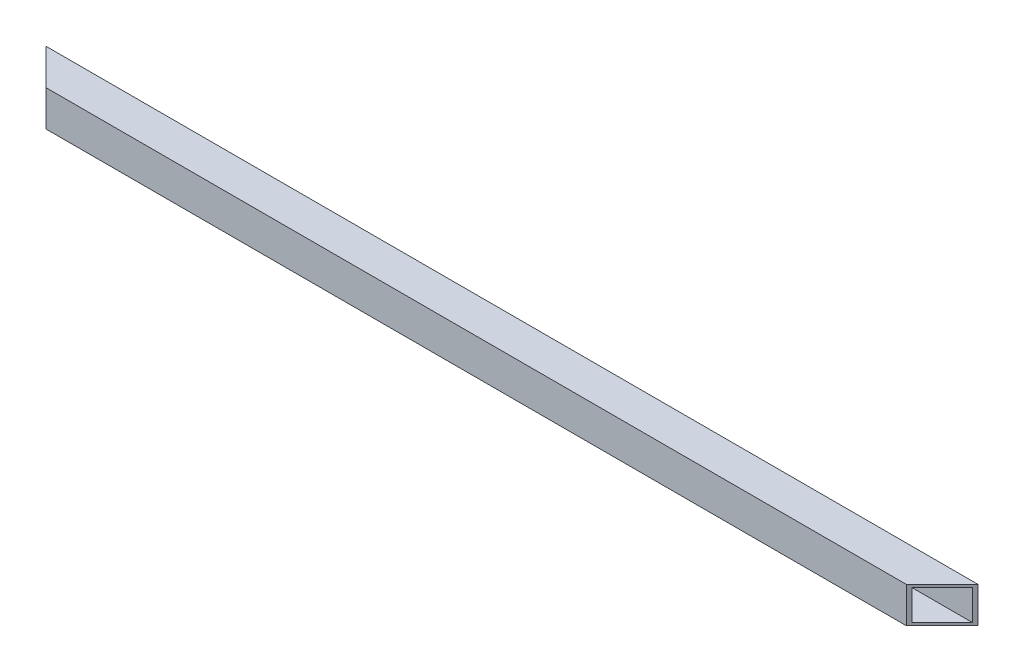
ISO-10303-21;
HEADER;
FILE_DESCRIPTION(('STEP AP214'),'2;1');
FILE_NAME('part.step','',(''),(''),'','','');
FILE_SCHEMA(('AUTOMOTIVE_DESIGN { 1 0 10303 214 1 1 1 1 }'));
ENDSEC;
DATA;
#1=APPLICATION_CONTEXT('core data for automotive mechanical design processes');
#2=APPLICATION_PROTOCOL_DEFINITION('international standard','automotive_design',2000,#1);
#3=PRODUCT_CONTEXT('',#1,'mechanical');
#4=PRODUCT('Part','Part','',(#3));
#5=PRODUCT_RELATED_PRODUCT_CATEGORY('part','',(#4));
#6=PRODUCT_DEFINITION_FORMATION('','',#4);
#7=PRODUCT_DEFINITION_CONTEXT('part definition',#1,'design');
#8=PRODUCT_DEFINITION('design','',#6,#7);
#9=PRODUCT_DEFINITION_SHAPE('','',#8);
#10=(LENGTH_UNIT() NAMED_UNIT(*) SI_UNIT(.MILLI.,.METRE.));
#11=(NAMED_UNIT(*) PLANE_ANGLE_UNIT() SI_UNIT($,.RADIAN.));
#12=(NAMED_UNIT(*) SI_UNIT($,.STERADIAN.) SOLID_ANGLE_UNIT());
#13=UNCERTAINTY_MEASURE_WITH_UNIT(LENGTH_MEASURE(1.E-05),#10,'distance_accuracy_value','');
#14=(GEOMETRIC_REPRESENTATION_CONTEXT(3) GLOBAL_UNCERTAINTY_ASSIGNED_CONTEXT((#13)) GLOBAL_UNIT_ASSIGNED_CONTEXT((#10,
#11,#12)) REPRESENTATION_CONTEXT('',''));
#15=CARTESIAN_POINT('',(0.,0.,0.));
#16=DIRECTION('',(0.,0.,1.));
#17=DIRECTION('',(1.,0.,0.));
#18=AXIS2_PLACEMENT_3D('',#15,#16,#17);
#19=CARTESIAN_POINT('',(250.,210.,-2310.));
#20=DIRECTION('',(0.,1.,0.));
#21=DIRECTION('',(0.,0.,1.));
#22=AXIS2_PLACEMENT_3D('',#19,#20,#21);
#23=PLANE('',#22);
#24=DIRECTION('',(0.707106781186548,0.,-0.707106781186548));
#25=VECTOR('',#24,1.);
#26=CARTESIAN_POINT('',(255.,210.,-2305.));
#27=LINE('',#26,#25);
#28=CARTESIAN_POINT('',(240.,210.,-2290.));
#29=VERTEX_POINT('',#28);
#30=CARTESIAN_POINT('',(260.,210.,-2310.));
#31=VERTEX_POINT('',#30);
#32=EDGE_CURVE('E166',#29,#31,#27,.T.);
#33=ORIENTED_EDGE('',*,*,#32,.F.);
#34=DIRECTION('',(-1.,0.,0.));
#35=VECTOR('',#34,1.);
#36=CARTESIAN_POINT('',(250.,210.,-2290.));
#37=LINE('',#36,#35);
#38=CARTESIAN_POINT('',(-240.,210.,-2290.));
#39=VERTEX_POINT('',#38);
#40=EDGE_CURVE('E53',#29,#39,#37,.T.);
#41=ORIENTED_EDGE('',*,*,#40,.T.);
#42=DIRECTION('',(0.707106781186548,0.,0.707106781186547));
#43=VECTOR('',#42,1.);
#44=CARTESIAN_POINT('',(-4.99999999999984,210.,-2055.));
#45=LINE('',#44,#43);
#46=CARTESIAN_POINT('',(-260.,210.,-2310.));
#47=VERTEX_POINT('',#46);
#48=EDGE_CURVE('E128',#47,#39,#45,.T.);
#49=ORIENTED_EDGE('',*,*,#48,.F.);
#50=DIRECTION('',(-1.,0.,0.));
#51=VECTOR('',#50,1.);
#52=CARTESIAN_POINT('',(250.,210.,-2310.));
#53=LINE('',#52,#51);
#54=EDGE_CURVE('E132',#31,#47,#53,.T.);
#55=ORIENTED_EDGE('',*,*,#54,.F.);
#56=EDGE_LOOP('',(#33,#41,#49,#55));
#57=FACE_BOUND('',#56,.T.);
#58=ADVANCED_FACE('F39',(#57),#23,.F.);
#59=CARTESIAN_POINT('',(250.,210.,-2310.));
#60=DIRECTION('',(0.,0.,1.));
#61=DIRECTION('',(1.,0.,0.));
#62=AXIS2_PLACEMENT_3D('',#59,#60,#61);
#63=PLANE('',#62);
#64=DIRECTION('',(0.,1.,0.));
#65=VECTOR('',#64,1.);
#66=CARTESIAN_POINT('',(260.,210.,-2310.));
#67=LINE('',#66,#65);
#68=CARTESIAN_POINT('',(260.,230.,-2310.));
#69=VERTEX_POINT('',#68);
#70=EDGE_CURVE('E163',#31,#69,#67,.T.);
#71=ORIENTED_EDGE('',*,*,#70,.F.);
#72=ORIENTED_EDGE('',*,*,#54,.T.);
#73=DIRECTION('',(0.,-1.,0.));
#74=VECTOR('',#73,1.);
#75=CARTESIAN_POINT('',(-260.,210.,-2310.));
#76=LINE('',#75,#74);
#77=CARTESIAN_POINT('',(-260.,230.,-2310.));
#78=VERTEX_POINT('',#77);
#79=EDGE_CURVE('E142',#78,#47,#76,.T.);
#80=ORIENTED_EDGE('',*,*,#79,.F.);
#81=DIRECTION('',(-1.,0.,0.));
#82=VECTOR('',#81,1.);
#83=CARTESIAN_POINT('',(250.,230.,-2310.));
#84=LINE('',#83,#82);
#85=EDGE_CURVE('E130',#69,#78,#84,.T.);
#86=ORIENTED_EDGE('',*,*,#85,.F.);
#87=EDGE_LOOP('',(#71,#72,#80,#86));
#88=FACE_BOUND('',#87,.T.);
#89=ADVANCED_FACE('F185',(#88),#63,.F.);
#90=CARTESIAN_POINT('',(250.,230.,-2310.));
#91=DIRECTION('',(0.,-1.,0.));
#92=DIRECTION('',(0.,0.,-1.));
#93=AXIS2_PLACEMENT_3D('',#90,#91,#92);
#94=PLANE('',#93);
#95=DIRECTION('',(-0.707106781186548,0.,0.707106781186548));
#96=VECTOR('',#95,1.);
#97=CARTESIAN_POINT('',(255.,230.,-2305.));
#98=LINE('',#97,#96);
#99=CARTESIAN_POINT('',(240.,230.,-2290.));
#100=VERTEX_POINT('',#99);
#101=EDGE_CURVE('E160',#69,#100,#98,.T.);
#102=ORIENTED_EDGE('',*,*,#101,.F.);
#103=ORIENTED_EDGE('',*,*,#85,.T.);
#104=DIRECTION('',(-0.707106781186548,0.,-0.707106781186547));
#105=VECTOR('',#104,1.);
#106=CARTESIAN_POINT('',(-4.99999999999984,230.,-2055.));
#107=LINE('',#106,#105);
#108=CARTESIAN_POINT('',(-240.,230.,-2290.));
#109=VERTEX_POINT('',#108);
#110=EDGE_CURVE('E145',#109,#78,#107,.T.);
#111=ORIENTED_EDGE('',*,*,#110,.F.);
#112=DIRECTION('',(-1.,0.,0.));
#113=VECTOR('',#112,1.);
#114=CARTESIAN_POINT('',(250.,230.,-2290.));
#115=LINE('',#114,#113);
#116=EDGE_CURVE('E127',#100,#109,#115,.T.);
#117=ORIENTED_EDGE('',*,*,#116,.F.);
#118=EDGE_LOOP('',(#102,#103,#111,#117));
#119=FACE_BOUND('',#118,.T.);
#120=ADVANCED_FACE('F189',(#119),#94,.F.);
#121=CARTESIAN_POINT('',(250.,210.,-2290.));
#122=DIRECTION('',(0.,0.,-1.));
#123=DIRECTION('',(-1.,0.,0.));
#124=AXIS2_PLACEMENT_3D('',#121,#122,#123);
#125=PLANE('',#124);
#126=DIRECTION('',(0.,-1.,0.));
#127=VECTOR('',#126,1.);
#128=CARTESIAN_POINT('',(240.,210.,-2290.));
#129=LINE('',#128,#127);
#130=EDGE_CURVE('E157',#100,#29,#129,.T.);
#131=ORIENTED_EDGE('',*,*,#130,.F.);
#132=ORIENTED_EDGE('',*,*,#116,.T.);
#133=DIRECTION('',(0.,1.,0.));
#134=VECTOR('',#133,1.);
#135=CARTESIAN_POINT('',(-240.,210.,-2290.));
#136=LINE('',#135,#134);
#137=EDGE_CURVE('E148',#39,#109,#136,.T.);
#138=ORIENTED_EDGE('',*,*,#137,.F.);
#139=ORIENTED_EDGE('',*,*,#40,.F.);
#140=EDGE_LOOP('',(#131,#132,#138,#139));
#141=FACE_BOUND('',#140,.T.);
#142=ADVANCED_FACE('F181',(#141),#125,.F.);
#143=CARTESIAN_POINT('',(-250.,220.,-2300.));
#144=DIRECTION('',(-0.707106781186547,0.,0.707106781186548));
#145=DIRECTION('',(0.707106781186548,0.,0.707106781186547));
#146=AXIS2_PLACEMENT_3D('',#143,#144,#145);
#147=PLANE('',#146);
#148=DIRECTION('',(0.,1.,0.));
#149=VECTOR('',#148,1.);
#150=CARTESIAN_POINT('',(-241.6,211.6,-2291.6));
#151=LINE('',#150,#149);
#152=CARTESIAN_POINT('',(-241.6,211.6,-2291.6));
#153=VERTEX_POINT('',#152);
#154=CARTESIAN_POINT('',(-241.6,228.4,-2291.6));
#155=VERTEX_POINT('',#154);
#156=EDGE_CURVE('E119',#153,#155,#151,.T.);
#157=ORIENTED_EDGE('',*,*,#156,.F.);
#158=DIRECTION('',(0.707106781186548,0.,0.707106781186547));
#159=VECTOR('',#158,1.);
#160=CARTESIAN_POINT('',(-4.19999999999998,211.6,-2054.2));
#161=LINE('',#160,#159);
#162=CARTESIAN_POINT('',(-258.4,211.6,-2308.4));
#163=VERTEX_POINT('',#162);
#164=EDGE_CURVE('E46',#163,#153,#161,.T.);
#165=ORIENTED_EDGE('',*,*,#164,.F.);
#166=DIRECTION('',(0.,-1.,0.));
#167=VECTOR('',#166,1.);
#168=CARTESIAN_POINT('',(-258.4,211.6,-2308.4));
#169=LINE('',#168,#167);
#170=CARTESIAN_POINT('',(-258.4,228.4,-2308.4));
#171=VERTEX_POINT('',#170);
#172=EDGE_CURVE('E154',#171,#163,#169,.T.);
#173=ORIENTED_EDGE('',*,*,#172,.F.);
#174=DIRECTION('',(-0.707106781186548,0.,-0.707106781186547));
#175=VECTOR('',#174,1.);
#176=CARTESIAN_POINT('',(-4.19999999999998,228.4,-2054.2));
#177=LINE('',#176,#175);
#178=EDGE_CURVE('E152',#155,#171,#177,.T.);
#179=ORIENTED_EDGE('',*,*,#178,.F.);
#180=EDGE_LOOP('',(#157,#165,#173,#179));
#181=FACE_BOUND('',#180,.T.);
#182=ORIENTED_EDGE('',*,*,#79,.T.);
#183=ORIENTED_EDGE('',*,*,#48,.T.);
#184=ORIENTED_EDGE('',*,*,#137,.T.);
#185=ORIENTED_EDGE('',*,*,#110,.T.);
#186=EDGE_LOOP('',(#182,#183,#184,#185));
#187=FACE_BOUND('',#186,.T.);
#188=ADVANCED_FACE('F178',(#181,#187),#147,.T.);
#189=CARTESIAN_POINT('',(250.,211.6,-2291.6));
#190=DIRECTION('',(0.,0.,-1.));
#191=DIRECTION('',(-1.,0.,0.));
#192=AXIS2_PLACEMENT_3D('',#189,#190,#191);
#193=PLANE('',#192);
#194=DIRECTION('',(-1.,0.,0.));
#195=VECTOR('',#194,1.);
#196=CARTESIAN_POINT('',(250.,228.4,-2291.6));
#197=LINE('',#196,#195);
#198=CARTESIAN_POINT('',(241.6,228.4,-2291.6));
#199=VERTEX_POINT('',#198);
#200=EDGE_CURVE('E110',#199,#155,#197,.T.);
#201=ORIENTED_EDGE('',*,*,#200,.F.);
#202=DIRECTION('',(0.,-1.,0.));
#203=VECTOR('',#202,1.);
#204=CARTESIAN_POINT('',(241.6,211.6,-2291.6));
#205=LINE('',#204,#203);
#206=CARTESIAN_POINT('',(241.6,211.6,-2291.6));
#207=VERTEX_POINT('',#206);
#208=EDGE_CURVE('E11',#199,#207,#205,.T.);
#209=ORIENTED_EDGE('',*,*,#208,.T.);
#210=DIRECTION('',(-1.,0.,0.));
#211=VECTOR('',#210,1.);
#212=CARTESIAN_POINT('',(250.,211.6,-2291.6));
#213=LINE('',#212,#211);
#214=EDGE_CURVE('E133',#207,#153,#213,.T.);
#215=ORIENTED_EDGE('',*,*,#214,.T.);
#216=ORIENTED_EDGE('',*,*,#156,.T.);
#217=EDGE_LOOP('',(#201,#209,#215,#216));
#218=FACE_BOUND('',#217,.T.);
#219=ADVANCED_FACE('F117',(#218),#193,.T.);
#220=CARTESIAN_POINT('',(250.,228.4,-2308.4));
#221=DIRECTION('',(0.,-1.,0.));
#222=DIRECTION('',(0.,0.,-1.));
#223=AXIS2_PLACEMENT_3D('',#220,#221,#222);
#224=PLANE('',#223);
#225=DIRECTION('',(-1.,0.,0.));
#226=VECTOR('',#225,1.);
#227=CARTESIAN_POINT('',(250.,228.4,-2308.4));
#228=LINE('',#227,#226);
#229=CARTESIAN_POINT('',(258.4,228.4,-2308.4));
#230=VERTEX_POINT('',#229);
#231=EDGE_CURVE('E112',#230,#171,#228,.T.);
#232=ORIENTED_EDGE('',*,*,#231,.F.);
#233=DIRECTION('',(-0.707106781186548,0.,0.707106781186548));
#234=VECTOR('',#233,1.);
#235=CARTESIAN_POINT('',(254.2,228.4,-2304.2));
#236=LINE('',#235,#234);
#237=EDGE_CURVE('E103',#230,#199,#236,.T.);
#238=ORIENTED_EDGE('',*,*,#237,.T.);
#239=ORIENTED_EDGE('',*,*,#200,.T.);
#240=ORIENTED_EDGE('',*,*,#178,.T.);
#241=EDGE_LOOP('',(#232,#238,#239,#240));
#242=FACE_BOUND('',#241,.T.);
#243=ADVANCED_FACE('F108',(#242),#224,.T.);
#244=CARTESIAN_POINT('',(250.,211.6,-2308.4));
#245=DIRECTION('',(0.,0.,1.));
#246=DIRECTION('',(1.,0.,0.));
#247=AXIS2_PLACEMENT_3D('',#244,#245,#246);
#248=PLANE('',#247);
#249=DIRECTION('',(-1.,0.,0.));
#250=VECTOR('',#249,1.);
#251=CARTESIAN_POINT('',(250.,211.6,-2308.4));
#252=LINE('',#251,#250);
#253=CARTESIAN_POINT('',(258.4,211.6,-2308.4));
#254=VERTEX_POINT('',#253);
#255=EDGE_CURVE('E122',#254,#163,#252,.T.);
#256=ORIENTED_EDGE('',*,*,#255,.F.);
#257=DIRECTION('',(0.,1.,0.));
#258=VECTOR('',#257,1.);
#259=CARTESIAN_POINT('',(258.4,211.6,-2308.4));
#260=LINE('',#259,#258);
#261=EDGE_CURVE('E114',#254,#230,#260,.T.);
#262=ORIENTED_EDGE('',*,*,#261,.T.);
#263=ORIENTED_EDGE('',*,*,#231,.T.);
#264=ORIENTED_EDGE('',*,*,#172,.T.);
#265=EDGE_LOOP('',(#256,#262,#263,#264));
#266=FACE_BOUND('',#265,.T.);
#267=ADVANCED_FACE('F172',(#266),#248,.T.);
#268=CARTESIAN_POINT('',(250.,211.6,-2308.4));
#269=DIRECTION('',(0.,1.,0.));
#270=DIRECTION('',(0.,0.,1.));
#271=AXIS2_PLACEMENT_3D('',#268,#269,#270);
#272=PLANE('',#271);
#273=ORIENTED_EDGE('',*,*,#214,.F.);
#274=DIRECTION('',(0.707106781186548,0.,-0.707106781186548));
#275=VECTOR('',#274,1.);
#276=CARTESIAN_POINT('',(254.2,211.6,-2304.2));
#277=LINE('',#276,#275);
#278=EDGE_CURVE('E61',#207,#254,#277,.T.);
#279=ORIENTED_EDGE('',*,*,#278,.T.);
#280=ORIENTED_EDGE('',*,*,#255,.T.);
#281=ORIENTED_EDGE('',*,*,#164,.T.);
#282=EDGE_LOOP('',(#273,#279,#280,#281));
#283=FACE_BOUND('',#282,.T.);
#284=ADVANCED_FACE('F176',(#283),#272,.T.);
#285=CARTESIAN_POINT('',(250.,220.,-2300.));
#286=DIRECTION('',(0.707106781186548,0.,0.707106781186548));
#287=DIRECTION('',(0.707106781186548,0.,-0.707106781186548));
#288=AXIS2_PLACEMENT_3D('',#285,#286,#287);
#289=PLANE('',#288);
#290=ORIENTED_EDGE('',*,*,#278,.F.);
#291=ORIENTED_EDGE('',*,*,#208,.F.);
#292=ORIENTED_EDGE('',*,*,#237,.F.);
#293=ORIENTED_EDGE('',*,*,#261,.F.);
#294=EDGE_LOOP('',(#290,#291,#292,#293));
#295=FACE_BOUND('',#294,.T.);
#296=ORIENTED_EDGE('',*,*,#101,.T.);
#297=ORIENTED_EDGE('',*,*,#130,.T.);
#298=ORIENTED_EDGE('',*,*,#32,.T.);
#299=ORIENTED_EDGE('',*,*,#70,.T.);
#300=EDGE_LOOP('',(#296,#297,#298,#299));
#301=FACE_BOUND('',#300,.T.);
#302=ADVANCED_FACE('F101',(#295,#301),#289,.T.);
#303=CLOSED_SHELL('',(#58,#89,#120,#142,#188,#219,#243,#267,#284,#302));
#304=MANIFOLD_SOLID_BREP('B2',#303);
#305=ADVANCED_BREP_SHAPE_REPRESENTATION('',(#18,#304),#14);
#306=SHAPE_DEFINITION_REPRESENTATION(#9,#305);
ENDSEC;
END-ISO-10303-21;
